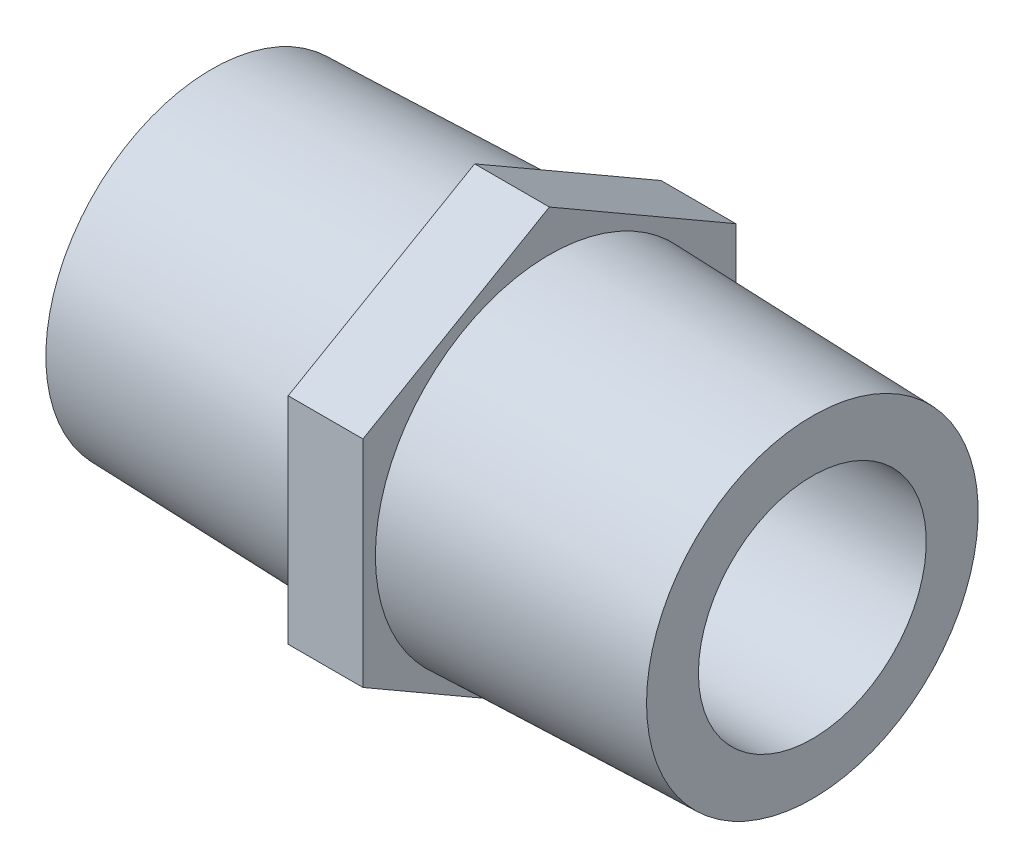
ISO-10303-21;
HEADER;
FILE_DESCRIPTION(('STEP AP214'),'2;1');
FILE_NAME('part.step','',(''),(''),'','','');
FILE_SCHEMA(('AUTOMOTIVE_DESIGN { 1 0 10303 214 1 1 1 1 }'));
ENDSEC;
DATA;
#1=APPLICATION_CONTEXT('core data for automotive mechanical design processes');
#2=APPLICATION_PROTOCOL_DEFINITION('international standard','automotive_design',2000,#1);
#3=PRODUCT_CONTEXT('',#1,'mechanical');
#4=PRODUCT('Part','Part','',(#3));
#5=PRODUCT_RELATED_PRODUCT_CATEGORY('part','',(#4));
#6=PRODUCT_DEFINITION_FORMATION('','',#4);
#7=PRODUCT_DEFINITION_CONTEXT('part definition',#1,'design');
#8=PRODUCT_DEFINITION('design','',#6,#7);
#9=PRODUCT_DEFINITION_SHAPE('','',#8);
#10=(LENGTH_UNIT() NAMED_UNIT(*) SI_UNIT(.MILLI.,.METRE.));
#11=(NAMED_UNIT(*) PLANE_ANGLE_UNIT() SI_UNIT($,.RADIAN.));
#12=(NAMED_UNIT(*) SI_UNIT($,.STERADIAN.) SOLID_ANGLE_UNIT());
#13=UNCERTAINTY_MEASURE_WITH_UNIT(LENGTH_MEASURE(1.E-05),#10,'distance_accuracy_value','');
#14=(GEOMETRIC_REPRESENTATION_CONTEXT(3) GLOBAL_UNCERTAINTY_ASSIGNED_CONTEXT((#13)) GLOBAL_UNIT_ASSIGNED_CONTEXT((#10,
#11,#12)) REPRESENTATION_CONTEXT('',''));
#15=CARTESIAN_POINT('',(0.,0.,0.));
#16=DIRECTION('',(0.,0.,1.));
#17=DIRECTION('',(1.,0.,0.));
#18=AXIS2_PLACEMENT_3D('',#15,#16,#17);
#19=CARTESIAN_POINT('',(2.86385000000001,0.,0.));
#20=DIRECTION('',(-1.,0.,0.));
#21=DIRECTION('',(0.,0.,1.));
#22=AXIS2_PLACEMENT_3D('',#19,#20,#21);
#23=CONICAL_SURFACE('',#22,13.335,0.0311250382690475);
#24=CARTESIAN_POINT('',(23.01875,0.,0.));
#25=DIRECTION('',(-1.,0.,0.));
#26=DIRECTION('',(0.,0.,1.));
#27=AXIS2_PLACEMENT_3D('',#24,#25,#26);
#28=CIRCLE('',#27,12.707475311155);
#29=CARTESIAN_POINT('',(23.01875,0.,12.707475311155));
#30=VERTEX_POINT('',#29);
#31=EDGE_CURVE('E11',#30,#30,#28,.T.);
#32=ORIENTED_EDGE('',*,*,#31,.T.);
#33=EDGE_LOOP('',(#32));
#34=FACE_BOUND('',#33,.T.);
#35=CARTESIAN_POINT('',(2.86385000000001,0.,0.));
#36=DIRECTION('',(-1.,0.,0.));
#37=DIRECTION('',(0.,0.,1.));
#38=AXIS2_PLACEMENT_3D('',#35,#36,#37);
#39=CIRCLE('',#38,13.335);
#40=CARTESIAN_POINT('',(2.86385000000001,0.,13.335));
#41=VERTEX_POINT('',#40);
#42=EDGE_CURVE('E137',#41,#41,#39,.T.);
#43=ORIENTED_EDGE('',*,*,#42,.F.);
#44=EDGE_LOOP('',(#43));
#45=FACE_BOUND('',#44,.T.);
#46=ADVANCED_FACE('F32',(#34,#45),#23,.T.);
#47=CARTESIAN_POINT('',(23.01875,-12.707475311155,0.));
#48=DIRECTION('',(1.,0.,0.));
#49=DIRECTION('',(0.,0.,-1.));
#50=AXIS2_PLACEMENT_3D('',#47,#48,#49);
#51=PLANE('',#50);
#52=CARTESIAN_POINT('',(23.01875,0.,0.));
#53=DIRECTION('',(-1.,0.,0.));
#54=DIRECTION('',(0.,0.,1.));
#55=AXIS2_PLACEMENT_3D('',#52,#53,#54);
#56=CIRCLE('',#55,8.73125);
#57=CARTESIAN_POINT('',(23.01875,0.,8.73125));
#58=VERTEX_POINT('',#57);
#59=EDGE_CURVE('E40',#58,#58,#56,.T.);
#60=ORIENTED_EDGE('',*,*,#59,.T.);
#61=EDGE_LOOP('',(#60));
#62=FACE_BOUND('',#61,.T.);
#63=ORIENTED_EDGE('',*,*,#31,.F.);
#64=EDGE_LOOP('',(#63));
#65=FACE_BOUND('',#64,.T.);
#66=ADVANCED_FACE('F147',(#62,#65),#51,.T.);
#67=CARTESIAN_POINT('',(2.86385,0.,0.));
#68=DIRECTION('',(-1.,0.,0.));
#69=DIRECTION('',(0.,0.,1.));
#70=AXIS2_PLACEMENT_3D('',#67,#68,#69);
#71=CYLINDRICAL_SURFACE('',#70,8.73125);
#72=ORIENTED_EDGE('',*,*,#59,.F.);
#73=EDGE_LOOP('',(#72));
#74=FACE_BOUND('',#73,.T.);
#75=CARTESIAN_POINT('',(-23.01875,0.,0.));
#76=DIRECTION('',(1.,0.,0.));
#77=DIRECTION('',(0.,0.,-1.));
#78=AXIS2_PLACEMENT_3D('',#75,#76,#77);
#79=CIRCLE('',#78,8.73125);
#80=CARTESIAN_POINT('',(-23.01875,0.,-8.73125));
#81=VERTEX_POINT('',#80);
#82=EDGE_CURVE('E157',#81,#81,#79,.T.);
#83=ORIENTED_EDGE('',*,*,#82,.F.);
#84=EDGE_LOOP('',(#83));
#85=FACE_BOUND('',#84,.T.);
#86=ADVANCED_FACE('F150',(#74,#85),#71,.F.);
#87=CARTESIAN_POINT('',(-2.86385,8.24889197104679,-14.2875));
#88=DIRECTION('',(0.,0.866025403784439,-0.5));
#89=DIRECTION('',(0.,0.5,0.866025403784439));
#90=AXIS2_PLACEMENT_3D('',#87,#88,#89);
#91=PLANE('',#90);
#92=DIRECTION('',(0.,0.5,0.866025403784439));
#93=VECTOR('',#92,1.);
#94=CARTESIAN_POINT('',(2.86385,8.24889197104679,-14.2875));
#95=LINE('',#94,#93);
#96=CARTESIAN_POINT('',(2.86385,8.24889197104679,-14.2875));
#97=VERTEX_POINT('',#96);
#98=CARTESIAN_POINT('',(2.86385,16.4977839420936,0.));
#99=VERTEX_POINT('',#98);
#100=EDGE_CURVE('E119',#97,#99,#95,.T.);
#101=ORIENTED_EDGE('',*,*,#100,.F.);
#102=DIRECTION('',(1.,0.,0.));
#103=VECTOR('',#102,1.);
#104=CARTESIAN_POINT('',(-2.86385,8.24889197104679,-14.2875));
#105=LINE('',#104,#103);
#106=CARTESIAN_POINT('',(-2.86385,8.24889197104679,-14.2875));
#107=VERTEX_POINT('',#106);
#108=EDGE_CURVE('E48',#107,#97,#105,.T.);
#109=ORIENTED_EDGE('',*,*,#108,.F.);
#110=DIRECTION('',(0.,0.5,0.866025403784439));
#111=VECTOR('',#110,1.);
#112=CARTESIAN_POINT('',(-2.86385,8.24889197104679,-14.2875));
#113=LINE('',#112,#111);
#114=CARTESIAN_POINT('',(-2.86385,16.4977839420936,0.));
#115=VERTEX_POINT('',#114);
#116=EDGE_CURVE('E135',#107,#115,#113,.T.);
#117=ORIENTED_EDGE('',*,*,#116,.T.);
#118=DIRECTION('',(1.,0.,0.));
#119=VECTOR('',#118,1.);
#120=CARTESIAN_POINT('',(-2.86385,16.4977839420936,0.));
#121=LINE('',#120,#119);
#122=EDGE_CURVE('E83',#115,#99,#121,.T.);
#123=ORIENTED_EDGE('',*,*,#122,.T.);
#124=EDGE_LOOP('',(#101,#109,#117,#123));
#125=FACE_BOUND('',#124,.T.);
#126=ADVANCED_FACE('F153',(#125),#91,.T.);
#127=CARTESIAN_POINT('',(-2.86385,-8.24889197104678,-14.2875));
#128=DIRECTION('',(0.,0.,-1.));
#129=DIRECTION('',(0.,1.,0.));
#130=AXIS2_PLACEMENT_3D('',#127,#128,#129);
#131=PLANE('',#130);
#132=DIRECTION('',(0.,1.,0.));
#133=VECTOR('',#132,1.);
#134=CARTESIAN_POINT('',(2.86385,-8.24889197104678,-14.2875));
#135=LINE('',#134,#133);
#136=CARTESIAN_POINT('',(2.86385,-8.24889197104678,-14.2875));
#137=VERTEX_POINT('',#136);
#138=EDGE_CURVE('E132',#137,#97,#135,.T.);
#139=ORIENTED_EDGE('',*,*,#138,.F.);
#140=DIRECTION('',(1.,0.,0.));
#141=VECTOR('',#140,1.);
#142=CARTESIAN_POINT('',(-2.86385,-8.24889197104678,-14.2875));
#143=LINE('',#142,#141);
#144=CARTESIAN_POINT('',(-2.86385,-8.24889197104678,-14.2875));
#145=VERTEX_POINT('',#144);
#146=EDGE_CURVE('E71',#145,#137,#143,.T.);
#147=ORIENTED_EDGE('',*,*,#146,.F.);
#148=DIRECTION('',(0.,1.,0.));
#149=VECTOR('',#148,1.);
#150=CARTESIAN_POINT('',(-2.86385,-8.24889197104678,-14.2875));
#151=LINE('',#150,#149);
#152=EDGE_CURVE('E109',#145,#107,#151,.T.);
#153=ORIENTED_EDGE('',*,*,#152,.T.);
#154=ORIENTED_EDGE('',*,*,#108,.T.);
#155=EDGE_LOOP('',(#139,#147,#153,#154));
#156=FACE_BOUND('',#155,.T.);
#157=ADVANCED_FACE('F170',(#156),#131,.T.);
#158=CARTESIAN_POINT('',(-2.86385,-16.4977839420936,0.));
#159=DIRECTION('',(0.,-0.866025403784439,-0.5));
#160=DIRECTION('',(0.,0.5,-0.866025403784439));
#161=AXIS2_PLACEMENT_3D('',#158,#159,#160);
#162=PLANE('',#161);
#163=DIRECTION('',(0.,0.5,-0.866025403784439));
#164=VECTOR('',#163,1.);
#165=CARTESIAN_POINT('',(2.86385,-16.4977839420936,0.));
#166=LINE('',#165,#164);
#167=CARTESIAN_POINT('',(2.86385,-16.4977839420936,0.));
#168=VERTEX_POINT('',#167);
#169=EDGE_CURVE('E96',#168,#137,#166,.T.);
#170=ORIENTED_EDGE('',*,*,#169,.F.);
#171=DIRECTION('',(1.,0.,0.));
#172=VECTOR('',#171,1.);
#173=CARTESIAN_POINT('',(-2.86385,-16.4977839420936,0.));
#174=LINE('',#173,#172);
#175=CARTESIAN_POINT('',(-2.86385,-16.4977839420936,0.));
#176=VERTEX_POINT('',#175);
#177=EDGE_CURVE('E91',#176,#168,#174,.T.);
#178=ORIENTED_EDGE('',*,*,#177,.F.);
#179=DIRECTION('',(0.,0.5,-0.866025403784439));
#180=VECTOR('',#179,1.);
#181=CARTESIAN_POINT('',(-2.86385,-16.4977839420936,0.));
#182=LINE('',#181,#180);
#183=EDGE_CURVE('E94',#176,#145,#182,.T.);
#184=ORIENTED_EDGE('',*,*,#183,.T.);
#185=ORIENTED_EDGE('',*,*,#146,.T.);
#186=EDGE_LOOP('',(#170,#178,#184,#185));
#187=FACE_BOUND('',#186,.T.);
#188=ADVANCED_FACE('F93',(#187),#162,.T.);
#189=CARTESIAN_POINT('',(-2.86385,-8.24889197104676,14.2875));
#190=DIRECTION('',(0.,-0.866025403784438,0.5));
#191=DIRECTION('',(0.,-0.5,-0.866025403784439));
#192=AXIS2_PLACEMENT_3D('',#189,#190,#191);
#193=PLANE('',#192);
#194=DIRECTION('',(0.,-0.5,-0.866025403784438));
#195=VECTOR('',#194,1.);
#196=CARTESIAN_POINT('',(2.86385,-8.24889197104676,14.2875));
#197=LINE('',#196,#195);
#198=CARTESIAN_POINT('',(2.86385,-8.24889197104676,14.2875));
#199=VERTEX_POINT('',#198);
#200=EDGE_CURVE('E129',#199,#168,#197,.T.);
#201=ORIENTED_EDGE('',*,*,#200,.F.);
#202=DIRECTION('',(1.,0.,0.));
#203=VECTOR('',#202,1.);
#204=CARTESIAN_POINT('',(-2.86385,-8.24889197104676,14.2875));
#205=LINE('',#204,#203);
#206=CARTESIAN_POINT('',(-2.86385,-8.24889197104676,14.2875));
#207=VERTEX_POINT('',#206);
#208=EDGE_CURVE('E101',#207,#199,#205,.T.);
#209=ORIENTED_EDGE('',*,*,#208,.F.);
#210=DIRECTION('',(0.,-0.5,-0.866025403784438));
#211=VECTOR('',#210,1.);
#212=CARTESIAN_POINT('',(-2.86385,-8.24889197104676,14.2875));
#213=LINE('',#212,#211);
#214=EDGE_CURVE('E107',#207,#176,#213,.T.);
#215=ORIENTED_EDGE('',*,*,#214,.T.);
#216=ORIENTED_EDGE('',*,*,#177,.T.);
#217=EDGE_LOOP('',(#201,#209,#215,#216));
#218=FACE_BOUND('',#217,.T.);
#219=ADVANCED_FACE('F111',(#218),#193,.T.);
#220=CARTESIAN_POINT('',(-2.86385,8.24889197104679,14.2875));
#221=DIRECTION('',(0.,0.,1.));
#222=DIRECTION('',(0.,-1.,0.));
#223=AXIS2_PLACEMENT_3D('',#220,#221,#222);
#224=PLANE('',#223);
#225=DIRECTION('',(0.,-1.,0.));
#226=VECTOR('',#225,1.);
#227=CARTESIAN_POINT('',(2.86385,8.24889197104679,14.2875));
#228=LINE('',#227,#226);
#229=CARTESIAN_POINT('',(2.86385,8.24889197104679,14.2875));
#230=VERTEX_POINT('',#229);
#231=EDGE_CURVE('E126',#230,#199,#228,.T.);
#232=ORIENTED_EDGE('',*,*,#231,.F.);
#233=DIRECTION('',(1.,0.,0.));
#234=VECTOR('',#233,1.);
#235=CARTESIAN_POINT('',(-2.86385,8.24889197104679,14.2875));
#236=LINE('',#235,#234);
#237=CARTESIAN_POINT('',(-2.86385,8.24889197104679,14.2875));
#238=VERTEX_POINT('',#237);
#239=EDGE_CURVE('E140',#238,#230,#236,.T.);
#240=ORIENTED_EDGE('',*,*,#239,.F.);
#241=DIRECTION('',(0.,-1.,0.));
#242=VECTOR('',#241,1.);
#243=CARTESIAN_POINT('',(-2.86385,8.24889197104679,14.2875));
#244=LINE('',#243,#242);
#245=EDGE_CURVE('E112',#238,#207,#244,.T.);
#246=ORIENTED_EDGE('',*,*,#245,.T.);
#247=ORIENTED_EDGE('',*,*,#208,.T.);
#248=EDGE_LOOP('',(#232,#240,#246,#247));
#249=FACE_BOUND('',#248,.T.);
#250=ADVANCED_FACE('F232',(#249),#224,.T.);
#251=CARTESIAN_POINT('',(-2.86385,16.4977839420936,0.));
#252=DIRECTION('',(0.,0.866025403784439,0.5));
#253=DIRECTION('',(0.,-0.5,0.866025403784439));
#254=AXIS2_PLACEMENT_3D('',#251,#252,#253);
#255=PLANE('',#254);
#256=DIRECTION('',(0.,-0.5,0.866025403784439));
#257=VECTOR('',#256,1.);
#258=CARTESIAN_POINT('',(2.86385,16.4977839420936,0.));
#259=LINE('',#258,#257);
#260=EDGE_CURVE('E122',#99,#230,#259,.T.);
#261=ORIENTED_EDGE('',*,*,#260,.F.);
#262=ORIENTED_EDGE('',*,*,#122,.F.);
#263=DIRECTION('',(0.,-0.5,0.866025403784439));
#264=VECTOR('',#263,1.);
#265=CARTESIAN_POINT('',(-2.86385,16.4977839420936,0.));
#266=LINE('',#265,#264);
#267=EDGE_CURVE('E114',#115,#238,#266,.T.);
#268=ORIENTED_EDGE('',*,*,#267,.T.);
#269=ORIENTED_EDGE('',*,*,#239,.T.);
#270=EDGE_LOOP('',(#261,#262,#268,#269));
#271=FACE_BOUND('',#270,.T.);
#272=ADVANCED_FACE('F166',(#271),#255,.T.);
#273=CARTESIAN_POINT('',(-2.86385,16.4977839420936,0.));
#274=DIRECTION('',(1.,0.,0.));
#275=DIRECTION('',(0.,0.,-1.));
#276=AXIS2_PLACEMENT_3D('',#273,#274,#275);
#277=PLANE('',#276);
#278=CARTESIAN_POINT('',(-2.86385000000001,0.,0.));
#279=DIRECTION('',(1.,0.,0.));
#280=DIRECTION('',(0.,0.,-1.));
#281=AXIS2_PLACEMENT_3D('',#278,#279,#280);
#282=CIRCLE('',#281,13.335);
#283=CARTESIAN_POINT('',(-2.86385000000001,0.,-13.335));
#284=VERTEX_POINT('',#283);
#285=EDGE_CURVE('E159',#284,#284,#282,.T.);
#286=ORIENTED_EDGE('',*,*,#285,.T.);
#287=EDGE_LOOP('',(#286));
#288=FACE_BOUND('',#287,.T.);
#289=ORIENTED_EDGE('',*,*,#116,.F.);
#290=ORIENTED_EDGE('',*,*,#152,.F.);
#291=ORIENTED_EDGE('',*,*,#183,.F.);
#292=ORIENTED_EDGE('',*,*,#214,.F.);
#293=ORIENTED_EDGE('',*,*,#245,.F.);
#294=ORIENTED_EDGE('',*,*,#267,.F.);
#295=EDGE_LOOP('',(#289,#290,#291,#292,#293,#294));
#296=FACE_BOUND('',#295,.T.);
#297=ADVANCED_FACE('F105',(#288,#296),#277,.F.);
#298=CARTESIAN_POINT('',(2.86385,16.4977839420936,0.));
#299=DIRECTION('',(1.,0.,0.));
#300=DIRECTION('',(0.,0.,-1.));
#301=AXIS2_PLACEMENT_3D('',#298,#299,#300);
#302=PLANE('',#301);
#303=ORIENTED_EDGE('',*,*,#42,.T.);
#304=EDGE_LOOP('',(#303));
#305=FACE_BOUND('',#304,.T.);
#306=ORIENTED_EDGE('',*,*,#100,.T.);
#307=ORIENTED_EDGE('',*,*,#260,.T.);
#308=ORIENTED_EDGE('',*,*,#231,.T.);
#309=ORIENTED_EDGE('',*,*,#200,.T.);
#310=ORIENTED_EDGE('',*,*,#169,.T.);
#311=ORIENTED_EDGE('',*,*,#138,.T.);
#312=EDGE_LOOP('',(#306,#307,#308,#309,#310,#311));
#313=FACE_BOUND('',#312,.T.);
#314=ADVANCED_FACE('F169',(#305,#313),#302,.T.);
#315=CARTESIAN_POINT('',(-2.86385000000001,0.,0.));
#316=DIRECTION('',(1.,0.,0.));
#317=DIRECTION('',(0.,0.,-1.));
#318=AXIS2_PLACEMENT_3D('',#315,#316,#317);
#319=CONICAL_SURFACE('',#318,13.335,0.0311250382690475);
#320=CARTESIAN_POINT('',(-23.01875,0.,0.));
#321=DIRECTION('',(1.,0.,0.));
#322=DIRECTION('',(0.,0.,-1.));
#323=AXIS2_PLACEMENT_3D('',#320,#321,#322);
#324=CIRCLE('',#323,12.707475311155);
#325=CARTESIAN_POINT('',(-23.01875,0.,-12.707475311155));
#326=VERTEX_POINT('',#325);
#327=EDGE_CURVE('E123',#326,#326,#324,.T.);
#328=ORIENTED_EDGE('',*,*,#327,.T.);
#329=EDGE_LOOP('',(#328));
#330=FACE_BOUND('',#329,.T.);
#331=ORIENTED_EDGE('',*,*,#285,.F.);
#332=EDGE_LOOP('',(#331));
#333=FACE_BOUND('',#332,.T.);
#334=ADVANCED_FACE('F190',(#330,#333),#319,.T.);
#335=CARTESIAN_POINT('',(-23.01875,-12.707475311155,0.));
#336=DIRECTION('',(-1.,0.,0.));
#337=DIRECTION('',(0.,0.,1.));
#338=AXIS2_PLACEMENT_3D('',#335,#336,#337);
#339=PLANE('',#338);
#340=ORIENTED_EDGE('',*,*,#82,.T.);
#341=EDGE_LOOP('',(#340));
#342=FACE_BOUND('',#341,.T.);
#343=ORIENTED_EDGE('',*,*,#327,.F.);
#344=EDGE_LOOP('',(#343));
#345=FACE_BOUND('',#344,.T.);
#346=ADVANCED_FACE('F195',(#342,#345),#339,.T.);
#347=CLOSED_SHELL('',(#46,#66,#86,#126,#157,#188,#219,#250,#272,#297,#314,#334,#346));
#348=MANIFOLD_SOLID_BREP('B2',#347);
#349=ADVANCED_BREP_SHAPE_REPRESENTATION('',(#18,#348),#14);
#350=SHAPE_DEFINITION_REPRESENTATION(#9,#349);
ENDSEC;
END-ISO-10303-21;
